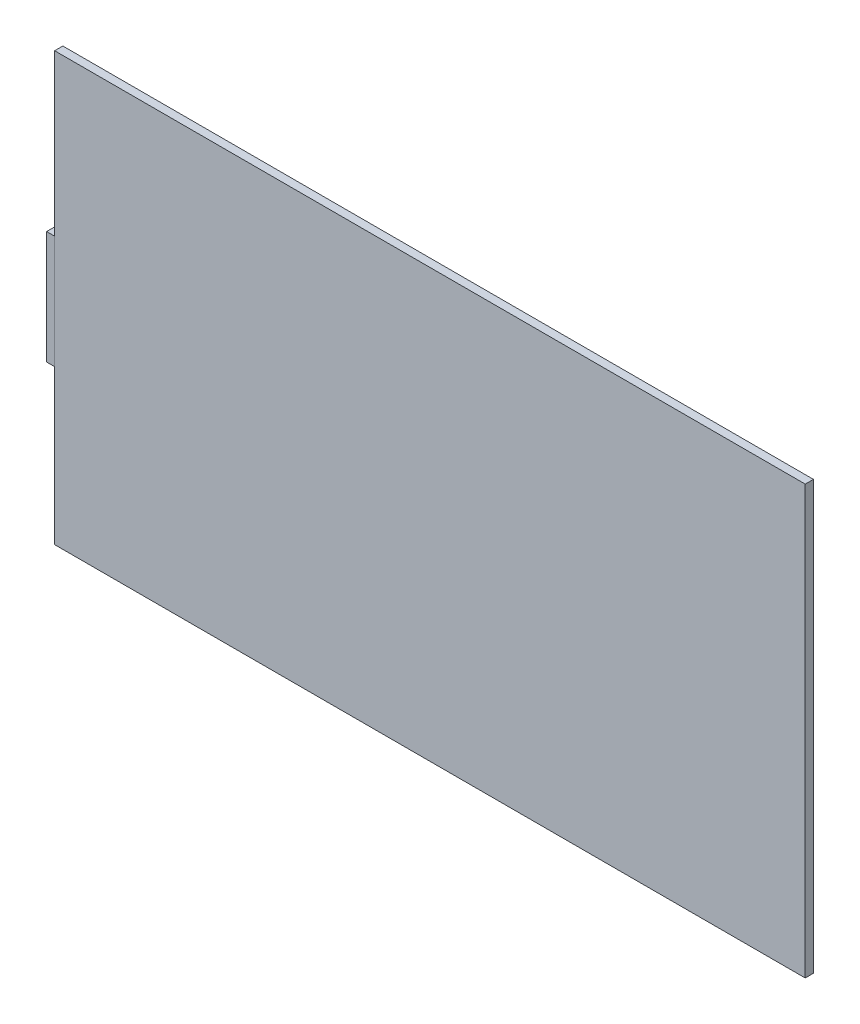
ISO-10303-21;
HEADER;
FILE_DESCRIPTION(('STEP AP214'),'2;1');
FILE_NAME('part.step','',(''),(''),'','','');
FILE_SCHEMA(('AUTOMOTIVE_DESIGN { 1 0 10303 214 1 1 1 1 }'));
ENDSEC;
DATA;
#1=APPLICATION_CONTEXT('core data for automotive mechanical design processes');
#2=APPLICATION_PROTOCOL_DEFINITION('international standard','automotive_design',2000,#1);
#3=PRODUCT_CONTEXT('',#1,'mechanical');
#4=PRODUCT('Part','Part','',(#3));
#5=PRODUCT_RELATED_PRODUCT_CATEGORY('part','',(#4));
#6=PRODUCT_DEFINITION_FORMATION('','',#4);
#7=PRODUCT_DEFINITION_CONTEXT('part definition',#1,'design');
#8=PRODUCT_DEFINITION('design','',#6,#7);
#9=PRODUCT_DEFINITION_SHAPE('','',#8);
#10=(LENGTH_UNIT() NAMED_UNIT(*) SI_UNIT(.MILLI.,.METRE.));
#11=(NAMED_UNIT(*) PLANE_ANGLE_UNIT() SI_UNIT($,.RADIAN.));
#12=(NAMED_UNIT(*) SI_UNIT($,.STERADIAN.) SOLID_ANGLE_UNIT());
#13=UNCERTAINTY_MEASURE_WITH_UNIT(LENGTH_MEASURE(1.E-05),#10,'distance_accuracy_value','');
#14=(GEOMETRIC_REPRESENTATION_CONTEXT(3) GLOBAL_UNCERTAINTY_ASSIGNED_CONTEXT((#13)) GLOBAL_UNIT_ASSIGNED_CONTEXT((#10,
#11,#12)) REPRESENTATION_CONTEXT('',''));
#15=CARTESIAN_POINT('',(0.,0.,0.));
#16=DIRECTION('',(0.,0.,1.));
#17=DIRECTION('',(1.,0.,0.));
#18=AXIS2_PLACEMENT_3D('',#15,#16,#17);
#19=CARTESIAN_POINT('',(0.,19.1,-14.0356688476182));
#20=DIRECTION('',(0.,1.,0.));
#21=DIRECTION('',(0.,0.,1.));
#22=AXIS2_PLACEMENT_3D('',#19,#20,#21);
#23=PLANE('',#22);
#24=DIRECTION('',(-1.,0.,0.));
#25=VECTOR('',#24,1.);
#26=CARTESIAN_POINT('',(0.,19.1,0.));
#27=LINE('',#26,#25);
#28=CARTESIAN_POINT('',(0.,19.1,0.));
#29=VERTEX_POINT('',#28);
#30=CARTESIAN_POINT('',(-1.00000000000001,19.1,0.));
#31=VERTEX_POINT('',#30);
#32=EDGE_CURVE('E12',#29,#31,#27,.T.);
#33=ORIENTED_EDGE('',*,*,#32,.F.);
#34=DIRECTION('',(0.,0.,1.));
#35=VECTOR('',#34,1.);
#36=CARTESIAN_POINT('',(0.,19.1,-14.0356688476182));
#37=LINE('',#36,#35);
#38=CARTESIAN_POINT('',(0.,19.1,1.016));
#39=VERTEX_POINT('',#38);
#40=EDGE_CURVE('E52',#29,#39,#37,.T.);
#41=ORIENTED_EDGE('',*,*,#40,.T.);
#42=DIRECTION('',(-1.,0.,0.));
#43=VECTOR('',#42,1.);
#44=CARTESIAN_POINT('',(0.,19.1,1.016));
#45=LINE('',#44,#43);
#46=CARTESIAN_POINT('',(-1.00000000000001,19.1,1.016));
#47=VERTEX_POINT('',#46);
#48=EDGE_CURVE('E108',#39,#47,#45,.T.);
#49=ORIENTED_EDGE('',*,*,#48,.T.);
#50=DIRECTION('',(0.,0.,1.));
#51=VECTOR('',#50,1.);
#52=CARTESIAN_POINT('',(-1.00000000000001,19.1,-14.0356688476182));
#53=LINE('',#52,#51);
#54=EDGE_CURVE('E87',#31,#47,#53,.T.);
#55=ORIENTED_EDGE('',*,*,#54,.F.);
#56=EDGE_LOOP('',(#33,#41,#49,#55));
#57=FACE_BOUND('',#56,.T.);
#58=ADVANCED_FACE('F47',(#57),#23,.F.);
#59=CARTESIAN_POINT('',(-1.00000000000001,33.1,-14.0356688476182));
#60=DIRECTION('',(-1.,0.,0.));
#61=DIRECTION('',(0.,0.,1.));
#62=AXIS2_PLACEMENT_3D('',#59,#60,#61);
#63=PLANE('',#62);
#64=DIRECTION('',(0.,0.,1.));
#65=VECTOR('',#64,1.);
#66=CARTESIAN_POINT('',(-1.00000000000001,33.1,-14.0356688476182));
#67=LINE('',#66,#65);
#68=CARTESIAN_POINT('',(-1.00000000000001,33.1,0.));
#69=VERTEX_POINT('',#68);
#70=CARTESIAN_POINT('',(-1.00000000000001,33.1,1.016));
#71=VERTEX_POINT('',#70);
#72=EDGE_CURVE('E99',#69,#71,#67,.T.);
#73=ORIENTED_EDGE('',*,*,#72,.F.);
#74=DIRECTION('',(0.,-1.,0.));
#75=VECTOR('',#74,1.);
#76=CARTESIAN_POINT('',(-1.00000000000001,33.1,0.));
#77=LINE('',#76,#75);
#78=EDGE_CURVE('E91',#69,#31,#77,.T.);
#79=ORIENTED_EDGE('',*,*,#78,.T.);
#80=ORIENTED_EDGE('',*,*,#54,.T.);
#81=DIRECTION('',(0.,-1.,0.));
#82=VECTOR('',#81,1.);
#83=CARTESIAN_POINT('',(-1.00000000000001,33.1,1.016));
#84=LINE('',#83,#82);
#85=EDGE_CURVE('E106',#71,#47,#84,.T.);
#86=ORIENTED_EDGE('',*,*,#85,.F.);
#87=EDGE_LOOP('',(#73,#79,#80,#86));
#88=FACE_BOUND('',#87,.T.);
#89=ADVANCED_FACE('F102',(#88),#63,.T.);
#90=CARTESIAN_POINT('',(0.,33.1,-14.0356688476182));
#91=DIRECTION('',(0.,1.,0.));
#92=DIRECTION('',(0.,0.,1.));
#93=AXIS2_PLACEMENT_3D('',#90,#91,#92);
#94=PLANE('',#93);
#95=DIRECTION('',(0.,0.,1.));
#96=VECTOR('',#95,1.);
#97=CARTESIAN_POINT('',(0.,33.1,-14.0356688476182));
#98=LINE('',#97,#96);
#99=CARTESIAN_POINT('',(0.,33.1,0.));
#100=VERTEX_POINT('',#99);
#101=CARTESIAN_POINT('',(0.,33.1,1.016));
#102=VERTEX_POINT('',#101);
#103=EDGE_CURVE('E72',#100,#102,#98,.T.);
#104=ORIENTED_EDGE('',*,*,#103,.F.);
#105=DIRECTION('',(-1.,0.,0.));
#106=VECTOR('',#105,1.);
#107=CARTESIAN_POINT('',(0.,33.1,0.));
#108=LINE('',#107,#106);
#109=EDGE_CURVE('E100',#100,#69,#108,.T.);
#110=ORIENTED_EDGE('',*,*,#109,.T.);
#111=ORIENTED_EDGE('',*,*,#72,.T.);
#112=DIRECTION('',(-1.,0.,0.));
#113=VECTOR('',#112,1.);
#114=CARTESIAN_POINT('',(0.,33.1,1.016));
#115=LINE('',#114,#113);
#116=EDGE_CURVE('E113',#102,#71,#115,.T.);
#117=ORIENTED_EDGE('',*,*,#116,.F.);
#118=EDGE_LOOP('',(#104,#110,#111,#117));
#119=FACE_BOUND('',#118,.T.);
#120=ADVANCED_FACE('F98',(#119),#94,.T.);
#121=CARTESIAN_POINT('',(0.,33.1,-14.0356688476182));
#122=DIRECTION('',(-1.,0.,0.));
#123=DIRECTION('',(0.,-1.,0.));
#124=AXIS2_PLACEMENT_3D('',#121,#122,#123);
#125=PLANE('',#124);
#126=DIRECTION('',(0.,-1.,0.));
#127=VECTOR('',#126,1.);
#128=CARTESIAN_POINT('',(0.,33.1,0.));
#129=LINE('',#128,#127);
#130=EDGE_CURVE('E59',#100,#29,#129,.T.);
#131=ORIENTED_EDGE('',*,*,#130,.F.);
#132=ORIENTED_EDGE('',*,*,#103,.T.);
#133=DIRECTION('',(0.,-1.,0.));
#134=VECTOR('',#133,1.);
#135=CARTESIAN_POINT('',(0.,33.1,1.016));
#136=LINE('',#135,#134);
#137=EDGE_CURVE('E111',#102,#39,#136,.T.);
#138=ORIENTED_EDGE('',*,*,#137,.T.);
#139=ORIENTED_EDGE('',*,*,#40,.F.);
#140=EDGE_LOOP('',(#131,#132,#138,#139));
#141=FACE_BOUND('',#140,.T.);
#142=ADVANCED_FACE('F123',(#141),#125,.F.);
#143=CARTESIAN_POINT('',(0.,0.,1.016));
#144=DIRECTION('',(0.,0.,1.));
#145=DIRECTION('',(1.,0.,0.));
#146=AXIS2_PLACEMENT_3D('',#143,#144,#145);
#147=PLANE('',#146);
#148=ORIENTED_EDGE('',*,*,#48,.F.);
#149=ORIENTED_EDGE('',*,*,#137,.F.);
#150=ORIENTED_EDGE('',*,*,#116,.T.);
#151=ORIENTED_EDGE('',*,*,#85,.T.);
#152=EDGE_LOOP('',(#148,#149,#150,#151));
#153=FACE_BOUND('',#152,.T.);
#154=ADVANCED_FACE('F122',(#153),#147,.T.);
#155=CARTESIAN_POINT('',(0.,0.,0.));
#156=DIRECTION('',(0.,0.,-1.));
#157=DIRECTION('',(-1.,0.,0.));
#158=AXIS2_PLACEMENT_3D('',#155,#156,#157);
#159=PLANE('',#158);
#160=ORIENTED_EDGE('',*,*,#130,.T.);
#161=ORIENTED_EDGE('',*,*,#32,.T.);
#162=ORIENTED_EDGE('',*,*,#78,.F.);
#163=ORIENTED_EDGE('',*,*,#109,.F.);
#164=EDGE_LOOP('',(#160,#161,#162,#163));
#165=FACE_BOUND('',#164,.T.);
#166=ADVANCED_FACE('F51',(#165),#159,.T.);
#167=CLOSED_SHELL('',(#58,#89,#120,#142,#154,#166));
#168=MANIFOLD_SOLID_BREP('B2',#167);
#169=CARTESIAN_POINT('',(0.,0.,1.016));
#170=DIRECTION('',(1.,0.,0.));
#171=DIRECTION('',(0.,1.,0.));
#172=AXIS2_PLACEMENT_3D('',#169,#170,#171);
#173=PLANE('',#172);
#174=DIRECTION('',(0.,-1.,0.));
#175=VECTOR('',#174,1.);
#176=CARTESIAN_POINT('',(0.,0.,0.));
#177=LINE('',#176,#175);
#178=CARTESIAN_POINT('',(0.,53.,0.));
#179=VERTEX_POINT('',#178);
#180=CARTESIAN_POINT('',(0.,0.,0.));
#181=VERTEX_POINT('',#180);
#182=EDGE_CURVE('E231',#179,#181,#177,.T.);
#183=ORIENTED_EDGE('',*,*,#182,.T.);
#184=DIRECTION('',(0.,0.,-1.));
#185=VECTOR('',#184,1.);
#186=CARTESIAN_POINT('',(0.,0.,1.016));
#187=LINE('',#186,#185);
#188=CARTESIAN_POINT('',(0.,0.,1.016));
#189=VERTEX_POINT('',#188);
#190=EDGE_CURVE('E50',#189,#181,#187,.T.);
#191=ORIENTED_EDGE('',*,*,#190,.F.);
#192=DIRECTION('',(0.,-1.,0.));
#193=VECTOR('',#192,1.);
#194=CARTESIAN_POINT('',(0.,0.,1.016));
#195=LINE('',#194,#193);
#196=CARTESIAN_POINT('',(0.,53.,1.016));
#197=VERTEX_POINT('',#196);
#198=EDGE_CURVE('E224',#197,#189,#195,.T.);
#199=ORIENTED_EDGE('',*,*,#198,.F.);
#200=DIRECTION('',(0.,0.,-1.));
#201=VECTOR('',#200,1.);
#202=CARTESIAN_POINT('',(0.,53.,1.016));
#203=LINE('',#202,#201);
#204=EDGE_CURVE('E232',#197,#179,#203,.T.);
#205=ORIENTED_EDGE('',*,*,#204,.T.);
#206=EDGE_LOOP('',(#183,#191,#199,#205));
#207=FACE_BOUND('',#206,.T.);
#208=ADVANCED_FACE('F175',(#207),#173,.F.);
#209=CARTESIAN_POINT('',(0.,0.,1.016));
#210=DIRECTION('',(0.,1.,0.));
#211=DIRECTION('',(0.,0.,1.));
#212=AXIS2_PLACEMENT_3D('',#209,#210,#211);
#213=PLANE('',#212);
#214=DIRECTION('',(1.,0.,0.));
#215=VECTOR('',#214,1.);
#216=CARTESIAN_POINT('',(0.,0.,0.));
#217=LINE('',#216,#215);
#218=CARTESIAN_POINT('',(93.,0.,0.));
#219=VERTEX_POINT('',#218);
#220=EDGE_CURVE('E230',#181,#219,#217,.T.);
#221=ORIENTED_EDGE('',*,*,#220,.T.);
#222=DIRECTION('',(0.,0.,-1.));
#223=VECTOR('',#222,1.);
#224=CARTESIAN_POINT('',(93.,0.,1.016));
#225=LINE('',#224,#223);
#226=CARTESIAN_POINT('',(93.,0.,1.016));
#227=VERTEX_POINT('',#226);
#228=EDGE_CURVE('E176',#227,#219,#225,.T.);
#229=ORIENTED_EDGE('',*,*,#228,.F.);
#230=DIRECTION('',(1.,0.,0.));
#231=VECTOR('',#230,1.);
#232=CARTESIAN_POINT('',(0.,0.,1.016));
#233=LINE('',#232,#231);
#234=EDGE_CURVE('E217',#189,#227,#233,.T.);
#235=ORIENTED_EDGE('',*,*,#234,.F.);
#236=ORIENTED_EDGE('',*,*,#190,.T.);
#237=EDGE_LOOP('',(#221,#229,#235,#236));
#238=FACE_BOUND('',#237,.T.);
#239=ADVANCED_FACE('F227',(#238),#213,.F.);
#240=CARTESIAN_POINT('',(93.,0.,1.016));
#241=DIRECTION('',(-1.,0.,0.));
#242=DIRECTION('',(0.,0.,1.));
#243=AXIS2_PLACEMENT_3D('',#240,#241,#242);
#244=PLANE('',#243);
#245=DIRECTION('',(0.,1.,0.));
#246=VECTOR('',#245,1.);
#247=CARTESIAN_POINT('',(93.,0.,0.));
#248=LINE('',#247,#246);
#249=CARTESIAN_POINT('',(93.,53.,0.));
#250=VERTEX_POINT('',#249);
#251=EDGE_CURVE('E202',#219,#250,#248,.T.);
#252=ORIENTED_EDGE('',*,*,#251,.T.);
#253=DIRECTION('',(0.,0.,-1.));
#254=VECTOR('',#253,1.);
#255=CARTESIAN_POINT('',(93.,53.,1.016));
#256=LINE('',#255,#254);
#257=CARTESIAN_POINT('',(93.,53.,1.016));
#258=VERTEX_POINT('',#257);
#259=EDGE_CURVE('E229',#258,#250,#256,.T.);
#260=ORIENTED_EDGE('',*,*,#259,.F.);
#261=DIRECTION('',(0.,1.,0.));
#262=VECTOR('',#261,1.);
#263=CARTESIAN_POINT('',(93.,0.,1.016));
#264=LINE('',#263,#262);
#265=EDGE_CURVE('E222',#227,#258,#264,.T.);
#266=ORIENTED_EDGE('',*,*,#265,.F.);
#267=ORIENTED_EDGE('',*,*,#228,.T.);
#268=EDGE_LOOP('',(#252,#260,#266,#267));
#269=FACE_BOUND('',#268,.T.);
#270=ADVANCED_FACE('F226',(#269),#244,.F.);
#271=CARTESIAN_POINT('',(0.,53.,1.016));
#272=DIRECTION('',(0.,-1.,0.));
#273=DIRECTION('',(0.,0.,-1.));
#274=AXIS2_PLACEMENT_3D('',#271,#272,#273);
#275=PLANE('',#274);
#276=DIRECTION('',(-1.,0.,0.));
#277=VECTOR('',#276,1.);
#278=CARTESIAN_POINT('',(0.,53.,0.));
#279=LINE('',#278,#277);
#280=EDGE_CURVE('E211',#250,#179,#279,.T.);
#281=ORIENTED_EDGE('',*,*,#280,.T.);
#282=ORIENTED_EDGE('',*,*,#204,.F.);
#283=DIRECTION('',(-1.,0.,0.));
#284=VECTOR('',#283,1.);
#285=CARTESIAN_POINT('',(0.,53.,1.016));
#286=LINE('',#285,#284);
#287=EDGE_CURVE('E189',#258,#197,#286,.T.);
#288=ORIENTED_EDGE('',*,*,#287,.F.);
#289=ORIENTED_EDGE('',*,*,#259,.T.);
#290=EDGE_LOOP('',(#281,#282,#288,#289));
#291=FACE_BOUND('',#290,.T.);
#292=ADVANCED_FACE('F245',(#291),#275,.F.);
#293=CARTESIAN_POINT('',(0.,0.,1.016));
#294=DIRECTION('',(0.,0.,-1.));
#295=DIRECTION('',(-1.,0.,0.));
#296=AXIS2_PLACEMENT_3D('',#293,#294,#295);
#297=PLANE('',#296);
#298=ORIENTED_EDGE('',*,*,#198,.T.);
#299=ORIENTED_EDGE('',*,*,#234,.T.);
#300=ORIENTED_EDGE('',*,*,#265,.T.);
#301=ORIENTED_EDGE('',*,*,#287,.T.);
#302=EDGE_LOOP('',(#298,#299,#300,#301));
#303=FACE_BOUND('',#302,.T.);
#304=ADVANCED_FACE('F218',(#303),#297,.F.);
#305=CARTESIAN_POINT('',(0.,0.,0.));
#306=DIRECTION('',(0.,0.,-1.));
#307=DIRECTION('',(-1.,0.,0.));
#308=AXIS2_PLACEMENT_3D('',#305,#306,#307);
#309=PLANE('',#308);
#310=ORIENTED_EDGE('',*,*,#182,.F.);
#311=ORIENTED_EDGE('',*,*,#280,.F.);
#312=ORIENTED_EDGE('',*,*,#251,.F.);
#313=ORIENTED_EDGE('',*,*,#220,.F.);
#314=EDGE_LOOP('',(#310,#311,#312,#313));
#315=FACE_BOUND('',#314,.T.);
#316=ADVANCED_FACE('F243',(#315),#309,.T.);
#317=CLOSED_SHELL('',(#208,#239,#270,#292,#304,#316));
#318=MANIFOLD_SOLID_BREP('B6',#317);
#319=ADVANCED_BREP_SHAPE_REPRESENTATION('',(#18,#168,#318),#14);
#320=SHAPE_DEFINITION_REPRESENTATION(#9,#319);
ENDSEC;
END-ISO-10303-21;
